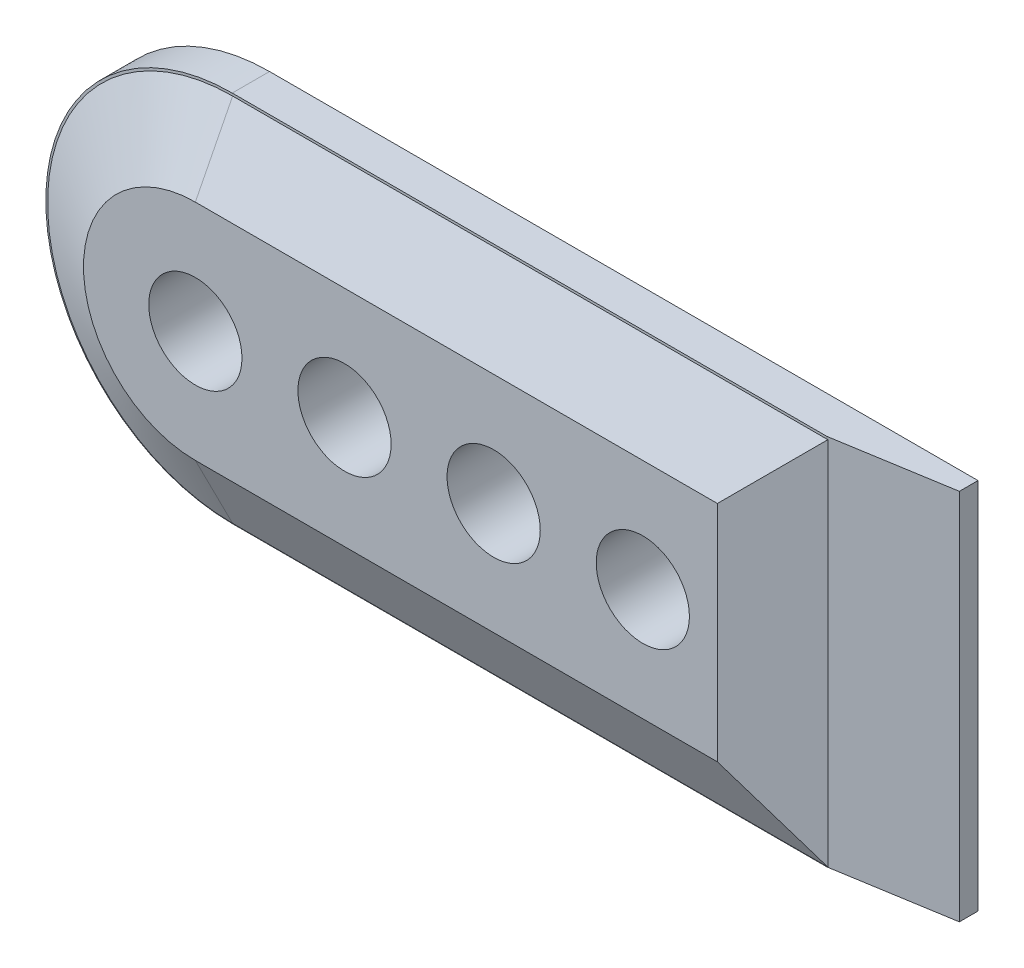
ISO-10303-21;
HEADER;
FILE_DESCRIPTION(('STEP AP214'),'2;1');
FILE_NAME('part.step','',(''),(''),'','','');
FILE_SCHEMA(('AUTOMOTIVE_DESIGN { 1 0 10303 214 1 1 1 1 }'));
ENDSEC;
DATA;
#1=APPLICATION_CONTEXT('core data for automotive mechanical design processes');
#2=APPLICATION_PROTOCOL_DEFINITION('international standard','automotive_design',2000,#1);
#3=PRODUCT_CONTEXT('',#1,'mechanical');
#4=PRODUCT('Part','Part','',(#3));
#5=PRODUCT_RELATED_PRODUCT_CATEGORY('part','',(#4));
#6=PRODUCT_DEFINITION_FORMATION('','',#4);
#7=PRODUCT_DEFINITION_CONTEXT('part definition',#1,'design');
#8=PRODUCT_DEFINITION('design','',#6,#7);
#9=PRODUCT_DEFINITION_SHAPE('','',#8);
#10=(LENGTH_UNIT() NAMED_UNIT(*) SI_UNIT(.MILLI.,.METRE.));
#11=(NAMED_UNIT(*) PLANE_ANGLE_UNIT() SI_UNIT($,.RADIAN.));
#12=(NAMED_UNIT(*) SI_UNIT($,.STERADIAN.) SOLID_ANGLE_UNIT());
#13=UNCERTAINTY_MEASURE_WITH_UNIT(LENGTH_MEASURE(1.E-05),#10,'distance_accuracy_value','');
#14=(GEOMETRIC_REPRESENTATION_CONTEXT(3) GLOBAL_UNCERTAINTY_ASSIGNED_CONTEXT((#13)) GLOBAL_UNIT_ASSIGNED_CONTEXT((#10,
#11,#12)) REPRESENTATION_CONTEXT('',''));
#15=CARTESIAN_POINT('',(0.,0.,0.));
#16=DIRECTION('',(0.,0.,1.));
#17=DIRECTION('',(1.,0.,0.));
#18=AXIS2_PLACEMENT_3D('',#15,#16,#17);
#19=CARTESIAN_POINT('',(-68.6937313432836,19.0594776119403,6.35));
#20=DIRECTION('',(0.,1.,0.));
#21=DIRECTION('',(-1.,0.,0.));
#22=AXIS2_PLACEMENT_3D('',#19,#20,#21);
#23=PLANE('',#22);
#24=DIRECTION('',(1.,0.,0.));
#25=VECTOR('',#24,1.);
#26=CARTESIAN_POINT('',(-68.6937313432836,19.0594776119403,6.35));
#27=LINE('',#26,#25);
#28=CARTESIAN_POINT('',(-68.6937313432836,19.0594776119403,6.35));
#29=VERTEX_POINT('',#28);
#30=CARTESIAN_POINT('',(32.5984115046971,19.0594776119403,6.35));
#31=VERTEX_POINT('',#30);
#32=EDGE_CURVE('E139',#29,#31,#27,.T.);
#33=ORIENTED_EDGE('',*,*,#32,.T.);
#34=DIRECTION('',(-0.986814797078086,0.,0.161853502488321));
#35=VECTOR('',#34,1.);
#36=CARTESIAN_POINT('',(1.86818450943302,19.0594776119403,11.3902516117227));
#37=LINE('',#36,#35);
#38=CARTESIAN_POINT('',(51.9562686567164,19.0594776119403,3.175));
#39=VERTEX_POINT('',#38);
#40=EDGE_CURVE('E124',#39,#31,#37,.T.);
#41=ORIENTED_EDGE('',*,*,#40,.F.);
#42=DIRECTION('',(0.,0.,-1.));
#43=VECTOR('',#42,1.);
#44=CARTESIAN_POINT('',(51.9562686567164,19.0594776119403,6.35));
#45=LINE('',#44,#43);
#46=CARTESIAN_POINT('',(51.9562686567164,19.0594776119403,0.));
#47=VERTEX_POINT('',#46);
#48=EDGE_CURVE('E43',#39,#47,#45,.T.);
#49=ORIENTED_EDGE('',*,*,#48,.T.);
#50=DIRECTION('',(1.,0.,0.));
#51=VECTOR('',#50,1.);
#52=CARTESIAN_POINT('',(-68.6937313432836,19.0594776119403,0.));
#53=LINE('',#52,#51);
#54=CARTESIAN_POINT('',(-68.6937313432836,19.0594776119403,0.));
#55=VERTEX_POINT('',#54);
#56=EDGE_CURVE('E160',#55,#47,#53,.T.);
#57=ORIENTED_EDGE('',*,*,#56,.F.);
#58=DIRECTION('',(0.,0.,-1.));
#59=VECTOR('',#58,1.);
#60=CARTESIAN_POINT('',(-68.6937313432836,19.0594776119403,6.35));
#61=LINE('',#60,#59);
#62=EDGE_CURVE('E12',#29,#55,#61,.T.);
#63=ORIENTED_EDGE('',*,*,#62,.F.);
#64=EDGE_LOOP('',(#33,#41,#49,#57,#63));
#65=FACE_BOUND('',#64,.T.);
#66=ADVANCED_FACE('F40',(#65),#23,.T.);
#67=CARTESIAN_POINT('',(-68.6937313432836,-44.4405223880597,6.35));
#68=DIRECTION('',(0.,1.,0.));
#69=DIRECTION('',(-1.,0.,0.));
#70=AXIS2_PLACEMENT_3D('',#67,#68,#69);
#71=PLANE('',#70);
#72=DIRECTION('',(-0.986814797078086,0.,0.161853502488321));
#73=VECTOR('',#72,1.);
#74=CARTESIAN_POINT('',(1.86818450943303,-44.4405223880597,11.3902516117227));
#75=LINE('',#74,#73);
#76=CARTESIAN_POINT('',(51.9562686567164,-44.4405223880597,3.175));
#77=VERTEX_POINT('',#76);
#78=CARTESIAN_POINT('',(32.5984115046971,-44.4405223880597,6.35));
#79=VERTEX_POINT('',#78);
#80=EDGE_CURVE('E127',#77,#79,#75,.T.);
#81=ORIENTED_EDGE('',*,*,#80,.T.);
#82=DIRECTION('',(1.,0.,0.));
#83=VECTOR('',#82,1.);
#84=CARTESIAN_POINT('',(-68.6937313432836,-44.4405223880597,6.35));
#85=LINE('',#84,#83);
#86=CARTESIAN_POINT('',(-68.6937313432836,-44.4405223880597,6.35));
#87=VERTEX_POINT('',#86);
#88=EDGE_CURVE('E151',#87,#79,#85,.T.);
#89=ORIENTED_EDGE('',*,*,#88,.F.);
#90=DIRECTION('',(0.,0.,-1.));
#91=VECTOR('',#90,1.);
#92=CARTESIAN_POINT('',(-68.6937313432836,-44.4405223880597,6.35));
#93=LINE('',#92,#91);
#94=CARTESIAN_POINT('',(-68.6937313432836,-44.4405223880597,0.));
#95=VERTEX_POINT('',#94);
#96=EDGE_CURVE('E49',#87,#95,#93,.T.);
#97=ORIENTED_EDGE('',*,*,#96,.T.);
#98=DIRECTION('',(1.,0.,0.));
#99=VECTOR('',#98,1.);
#100=CARTESIAN_POINT('',(-68.6937313432836,-44.4405223880597,0.));
#101=LINE('',#100,#99);
#102=CARTESIAN_POINT('',(51.9562686567164,-44.4405223880597,0.));
#103=VERTEX_POINT('',#102);
#104=EDGE_CURVE('E165',#95,#103,#101,.T.);
#105=ORIENTED_EDGE('',*,*,#104,.T.);
#106=DIRECTION('',(0.,0.,-1.));
#107=VECTOR('',#106,1.);
#108=CARTESIAN_POINT('',(51.9562686567164,-44.4405223880597,6.35));
#109=LINE('',#108,#107);
#110=EDGE_CURVE('E147',#77,#103,#109,.T.);
#111=ORIENTED_EDGE('',*,*,#110,.F.);
#112=EDGE_LOOP('',(#81,#89,#97,#105,#111));
#113=FACE_BOUND('',#112,.T.);
#114=ADVANCED_FACE('F177',(#113),#71,.F.);
#115=CARTESIAN_POINT('',(51.9562686567164,19.0594776119403,6.35));
#116=DIRECTION('',(1.,0.,0.));
#117=DIRECTION('',(0.,1.,0.));
#118=AXIS2_PLACEMENT_3D('',#115,#116,#117);
#119=PLANE('',#118);
#120=ORIENTED_EDGE('',*,*,#48,.F.);
#121=DIRECTION('',(0.,-1.,0.));
#122=VECTOR('',#121,1.);
#123=CARTESIAN_POINT('',(51.9562686567164,19.0594776119403,3.175));
#124=LINE('',#123,#122);
#125=EDGE_CURVE('E120',#39,#77,#124,.T.);
#126=ORIENTED_EDGE('',*,*,#125,.T.);
#127=ORIENTED_EDGE('',*,*,#110,.T.);
#128=DIRECTION('',(0.,-1.,0.));
#129=VECTOR('',#128,1.);
#130=CARTESIAN_POINT('',(51.9562686567164,19.0594776119403,0.));
#131=LINE('',#130,#129);
#132=EDGE_CURVE('E144',#47,#103,#131,.T.);
#133=ORIENTED_EDGE('',*,*,#132,.F.);
#134=EDGE_LOOP('',(#120,#126,#127,#133));
#135=FACE_BOUND('',#134,.T.);
#136=ADVANCED_FACE('F142',(#135),#119,.T.);
#137=CARTESIAN_POINT('',(-68.6937313432836,-12.6905223880597,6.35));
#138=DIRECTION('',(0.,0.,1.));
#139=DIRECTION('',(1.,0.,0.));
#140=AXIS2_PLACEMENT_3D('',#137,#138,#139);
#141=PLANE('',#140);
#142=ORIENTED_EDGE('',*,*,#88,.T.);
#143=DIRECTION('',(0.,-1.,0.));
#144=VECTOR('',#143,1.);
#145=CARTESIAN_POINT('',(32.5984115046971,19.0594776119403,6.35));
#146=LINE('',#145,#144);
#147=CARTESIAN_POINT('',(32.5984115046971,-44.3764724139776,6.35));
#148=VERTEX_POINT('',#147);
#149=EDGE_CURVE('E132',#148,#79,#146,.T.);
#150=ORIENTED_EDGE('',*,*,#149,.F.);
#151=DIRECTION('',(-1.,0.,0.));
#152=VECTOR('',#151,1.);
#153=CARTESIAN_POINT('',(-68.6273002290876,-44.3764724139776,6.35));
#154=LINE('',#153,#152);
#155=CARTESIAN_POINT('',(-68.6273002290876,-44.3764724139776,6.35));
#156=VERTEX_POINT('',#155);
#157=EDGE_CURVE('E64',#156,#148,#154,.F.);
#158=ORIENTED_EDGE('',*,*,#157,.F.);
#159=CARTESIAN_POINT('',(-68.6273002290876,-12.8638957040198,6.35));
#160=DIRECTION('',(0.,0.,1.));
#161=DIRECTION('',(1.,0.,0.));
#162=AXIS2_PLACEMENT_3D('',#159,#160,#161);
#163=CIRCLE('',#162,31.5125767099578);
#164=CARTESIAN_POINT('',(-68.6273002290876,18.648681005938,6.35));
#165=VERTEX_POINT('',#164);
#166=EDGE_CURVE('E225',#165,#156,#163,.T.);
#167=ORIENTED_EDGE('',*,*,#166,.F.);
#168=DIRECTION('',(1.,0.,0.));
#169=VECTOR('',#168,1.);
#170=CARTESIAN_POINT('',(-68.6273002290876,18.648681005938,6.35));
#171=LINE('',#170,#169);
#172=CARTESIAN_POINT('',(32.5984115046971,18.648681005938,6.35));
#173=VERTEX_POINT('',#172);
#174=EDGE_CURVE('E57',#173,#165,#171,.F.);
#175=ORIENTED_EDGE('',*,*,#174,.F.);
#176=EDGE_CURVE('E184',#31,#173,#146,.T.);
#177=ORIENTED_EDGE('',*,*,#176,.F.);
#178=ORIENTED_EDGE('',*,*,#32,.F.);
#179=CARTESIAN_POINT('',(-68.6937313432836,-12.6905223880597,6.35));
#180=DIRECTION('',(0.,0.,1.));
#181=DIRECTION('',(1.,0.,0.));
#182=AXIS2_PLACEMENT_3D('',#179,#180,#181);
#183=CIRCLE('',#182,31.75);
#184=EDGE_CURVE('E148',#29,#87,#183,.T.);
#185=ORIENTED_EDGE('',*,*,#184,.T.);
#186=EDGE_LOOP('',(#142,#150,#158,#167,#175,#177,#178,#185));
#187=FACE_BOUND('',#186,.T.);
#188=ADVANCED_FACE('F183',(#187),#141,.T.);
#189=CARTESIAN_POINT('',(-68.6937313432836,-12.6905223880597,6.35));
#190=DIRECTION('',(0.,0.,-1.));
#191=DIRECTION('',(-1.,0.,0.));
#192=AXIS2_PLACEMENT_3D('',#189,#190,#191);
#193=CYLINDRICAL_SURFACE('',#192,31.75);
#194=CARTESIAN_POINT('',(-68.6937313432836,-12.6905223880597,0.));
#195=DIRECTION('',(0.,0.,1.));
#196=DIRECTION('',(1.,0.,0.));
#197=AXIS2_PLACEMENT_3D('',#194,#195,#196);
#198=CIRCLE('',#197,31.75);
#199=EDGE_CURVE('E169',#55,#95,#198,.T.);
#200=ORIENTED_EDGE('',*,*,#199,.T.);
#201=ORIENTED_EDGE('',*,*,#96,.F.);
#202=ORIENTED_EDGE('',*,*,#184,.F.);
#203=ORIENTED_EDGE('',*,*,#62,.T.);
#204=EDGE_LOOP('',(#200,#201,#202,#203));
#205=FACE_BOUND('',#204,.T.);
#206=ADVANCED_FACE('F182',(#205),#193,.T.);
#207=CARTESIAN_POINT('',(-68.6937313432836,-12.6905223880597,0.));
#208=DIRECTION('',(0.,0.,1.));
#209=DIRECTION('',(1.,0.,0.));
#210=AXIS2_PLACEMENT_3D('',#207,#208,#209);
#211=PLANE('',#210);
#212=CARTESIAN_POINT('',(-68.6273002290876,-12.8638957040198,0.));
#213=DIRECTION('',(0.,0.,1.));
#214=DIRECTION('',(1.,0.,0.));
#215=AXIS2_PLACEMENT_3D('',#212,#213,#214);
#216=CIRCLE('',#215,7.9375);
#217=CARTESIAN_POINT('',(-60.6898002290876,-12.8638957040198,0.));
#218=VERTEX_POINT('',#217);
#219=EDGE_CURVE('E236',#218,#218,#216,.T.);
#220=ORIENTED_EDGE('',*,*,#219,.T.);
#221=EDGE_LOOP('',(#220));
#222=FACE_BOUND('',#221,.T.);
#223=CARTESIAN_POINT('',(-43.2273002290876,-12.8638957040198,0.));
#224=DIRECTION('',(0.,0.,1.));
#225=DIRECTION('',(1.,0.,0.));
#226=AXIS2_PLACEMENT_3D('',#223,#224,#225);
#227=CIRCLE('',#226,7.9375);
#228=CARTESIAN_POINT('',(-35.2898002290876,-12.8638957040198,0.));
#229=VERTEX_POINT('',#228);
#230=EDGE_CURVE('E241',#229,#229,#227,.T.);
#231=ORIENTED_EDGE('',*,*,#230,.T.);
#232=EDGE_LOOP('',(#231));
#233=FACE_BOUND('',#232,.T.);
#234=CARTESIAN_POINT('',(-17.8273002290876,-12.8638957040198,0.));
#235=DIRECTION('',(0.,0.,1.));
#236=DIRECTION('',(1.,0.,0.));
#237=AXIS2_PLACEMENT_3D('',#234,#235,#236);
#238=CIRCLE('',#237,7.9375);
#239=CARTESIAN_POINT('',(-9.88980022908756,-12.8638957040198,0.));
#240=VERTEX_POINT('',#239);
#241=EDGE_CURVE('E245',#240,#240,#238,.T.);
#242=ORIENTED_EDGE('',*,*,#241,.T.);
#243=EDGE_LOOP('',(#242));
#244=FACE_BOUND('',#243,.T.);
#245=CARTESIAN_POINT('',(7.57269977091243,-12.8638957040198,0.));
#246=DIRECTION('',(0.,0.,1.));
#247=DIRECTION('',(1.,0.,0.));
#248=AXIS2_PLACEMENT_3D('',#245,#246,#247);
#249=CIRCLE('',#248,7.9375);
#250=CARTESIAN_POINT('',(15.5101997709124,-12.8638957040198,0.));
#251=VERTEX_POINT('',#250);
#252=EDGE_CURVE('E249',#251,#251,#249,.T.);
#253=ORIENTED_EDGE('',*,*,#252,.T.);
#254=EDGE_LOOP('',(#253));
#255=FACE_BOUND('',#254,.T.);
#256=ORIENTED_EDGE('',*,*,#56,.T.);
#257=ORIENTED_EDGE('',*,*,#132,.T.);
#258=ORIENTED_EDGE('',*,*,#104,.F.);
#259=ORIENTED_EDGE('',*,*,#199,.F.);
#260=EDGE_LOOP('',(#256,#257,#258,#259));
#261=FACE_BOUND('',#260,.T.);
#262=ADVANCED_FACE('F181',(#222,#233,#244,#255,#261),#211,.F.);
#263=CARTESIAN_POINT('',(0.,0.,12.7));
#264=DIRECTION('',(0.,0.,1.));
#265=DIRECTION('',(1.,0.,0.));
#266=AXIS2_PLACEMENT_3D('',#263,#264,#265);
#267=PLANE('',#266);
#268=CARTESIAN_POINT('',(-68.6273002290876,-12.8638957040198,12.7));
#269=DIRECTION('',(0.,0.,1.));
#270=DIRECTION('',(1.,0.,0.));
#271=AXIS2_PLACEMENT_3D('',#268,#269,#270);
#272=CIRCLE('',#271,7.9375);
#273=CARTESIAN_POINT('',(-60.6898002290876,-12.8638957040198,12.7));
#274=VERTEX_POINT('',#273);
#275=EDGE_CURVE('E253',#274,#274,#272,.T.);
#276=ORIENTED_EDGE('',*,*,#275,.F.);
#277=EDGE_LOOP('',(#276));
#278=FACE_BOUND('',#277,.T.);
#279=CARTESIAN_POINT('',(-43.2273002290876,-12.8638957040198,12.7));
#280=DIRECTION('',(0.,0.,1.));
#281=DIRECTION('',(1.,0.,0.));
#282=AXIS2_PLACEMENT_3D('',#279,#280,#281);
#283=CIRCLE('',#282,7.9375);
#284=CARTESIAN_POINT('',(-35.2898002290876,-12.8638957040198,12.7));
#285=VERTEX_POINT('',#284);
#286=EDGE_CURVE('E262',#285,#285,#283,.T.);
#287=ORIENTED_EDGE('',*,*,#286,.F.);
#288=EDGE_LOOP('',(#287));
#289=FACE_BOUND('',#288,.T.);
#290=CARTESIAN_POINT('',(-17.8273002290876,-12.8638957040198,12.7));
#291=DIRECTION('',(0.,0.,1.));
#292=DIRECTION('',(1.,0.,0.));
#293=AXIS2_PLACEMENT_3D('',#290,#291,#292);
#294=CIRCLE('',#293,7.9375);
#295=CARTESIAN_POINT('',(-9.88980022908756,-12.8638957040198,12.7));
#296=VERTEX_POINT('',#295);
#297=EDGE_CURVE('E258',#296,#296,#294,.T.);
#298=ORIENTED_EDGE('',*,*,#297,.F.);
#299=EDGE_LOOP('',(#298));
#300=FACE_BOUND('',#299,.T.);
#301=CARTESIAN_POINT('',(7.57269977091243,-12.8638957040198,12.7));
#302=DIRECTION('',(0.,0.,1.));
#303=DIRECTION('',(1.,0.,0.));
#304=AXIS2_PLACEMENT_3D('',#301,#302,#303);
#305=CIRCLE('',#304,7.9375);
#306=CARTESIAN_POINT('',(15.5101997709124,-12.8638957040198,12.7));
#307=VERTEX_POINT('',#306);
#308=EDGE_CURVE('E254',#307,#307,#305,.T.);
#309=ORIENTED_EDGE('',*,*,#308,.F.);
#310=EDGE_LOOP('',(#309));
#311=FACE_BOUND('',#310,.T.);
#312=DIRECTION('',(1.,0.,0.));
#313=VECTOR('',#312,1.);
#314=CARTESIAN_POINT('',(-68.6273002290876,-31.9138957040198,12.7));
#315=LINE('',#314,#313);
#316=CARTESIAN_POINT('',(-68.6273002290876,-31.9138957040198,12.7));
#317=VERTEX_POINT('',#316);
#318=CARTESIAN_POINT('',(20.2726997709124,-31.9138957040198,12.7));
#319=VERTEX_POINT('',#318);
#320=EDGE_CURVE('E206',#317,#319,#315,.T.);
#321=ORIENTED_EDGE('',*,*,#320,.T.);
#322=DIRECTION('',(0.,1.,0.));
#323=VECTOR('',#322,1.);
#324=CARTESIAN_POINT('',(20.2726997709124,-31.9138957040198,12.7));
#325=LINE('',#324,#323);
#326=CARTESIAN_POINT('',(20.2726997709124,6.18610429598019,12.7));
#327=VERTEX_POINT('',#326);
#328=EDGE_CURVE('E191',#319,#327,#325,.T.);
#329=ORIENTED_EDGE('',*,*,#328,.T.);
#330=DIRECTION('',(-1.,0.,0.));
#331=VECTOR('',#330,1.);
#332=CARTESIAN_POINT('',(-68.6273002290876,6.18610429598019,12.7));
#333=LINE('',#332,#331);
#334=CARTESIAN_POINT('',(-68.6273002290876,6.18610429598019,12.7));
#335=VERTEX_POINT('',#334);
#336=EDGE_CURVE('E202',#327,#335,#333,.T.);
#337=ORIENTED_EDGE('',*,*,#336,.T.);
#338=CARTESIAN_POINT('',(-68.6273002290876,-12.8638957040198,12.7));
#339=DIRECTION('',(0.,0.,1.));
#340=DIRECTION('',(1.,0.,0.));
#341=AXIS2_PLACEMENT_3D('',#338,#339,#340);
#342=CIRCLE('',#341,19.05);
#343=EDGE_CURVE('E196',#335,#317,#342,.T.);
#344=ORIENTED_EDGE('',*,*,#343,.T.);
#345=EDGE_LOOP('',(#321,#329,#337,#344));
#346=FACE_BOUND('',#345,.T.);
#347=ADVANCED_FACE('F273',(#278,#289,#300,#311,#346),#267,.T.);
#348=CARTESIAN_POINT('',(20.2726997709124,-31.9138957040198,12.7));
#349=DIRECTION('',(0.453990499739545,0.,0.891006524188369));
#350=DIRECTION('',(0.891006524188369,0.,-0.453990499739545));
#351=AXIS2_PLACEMENT_3D('',#348,#349,#350);
#352=PLANE('',#351);
#353=DIRECTION('',(0.665246597127309,-0.665246597127309,-0.338960071425929));
#354=VECTOR('',#353,1.);
#355=CARTESIAN_POINT('',(20.2726997709124,-31.9138957040198,12.7));
#356=LINE('',#355,#354);
#357=CARTESIAN_POINT('',(32.7352764808702,-44.3764724139776,6.35));
#358=VERTEX_POINT('',#357);
#359=EDGE_CURVE('E197',#319,#358,#356,.T.);
#360=ORIENTED_EDGE('',*,*,#359,.T.);
#361=DIRECTION('',(0.,-1.,0.));
#362=VECTOR('',#361,1.);
#363=CARTESIAN_POINT('',(32.7352764808702,-31.9138957040198,6.35));
#364=LINE('',#363,#362);
#365=CARTESIAN_POINT('',(32.7352764808702,18.648681005938,6.35));
#366=VERTEX_POINT('',#365);
#367=EDGE_CURVE('E187',#358,#366,#364,.F.);
#368=ORIENTED_EDGE('',*,*,#367,.T.);
#369=DIRECTION('',(0.665246597127309,0.665246597127309,-0.338960071425929));
#370=VECTOR('',#369,1.);
#371=CARTESIAN_POINT('',(-19.070265039651,-33.1568605145832,32.7462418295457));
#372=LINE('',#371,#370);
#373=EDGE_CURVE('E198',#327,#366,#372,.T.);
#374=ORIENTED_EDGE('',*,*,#373,.F.);
#375=ORIENTED_EDGE('',*,*,#328,.F.);
#376=EDGE_LOOP('',(#360,#368,#374,#375));
#377=FACE_BOUND('',#376,.T.);
#378=ADVANCED_FACE('F276',(#377),#352,.T.);
#379=CARTESIAN_POINT('',(-68.6273002290876,6.18610429598019,12.7));
#380=DIRECTION('',(0.,0.453990499739545,0.891006524188369));
#381=DIRECTION('',(0.,-0.891006524188369,0.453990499739545));
#382=AXIS2_PLACEMENT_3D('',#379,#380,#381);
#383=PLANE('',#382);
#384=ORIENTED_EDGE('',*,*,#373,.T.);
#385=EDGE_CURVE('E229',#366,#173,#171,.F.);
#386=ORIENTED_EDGE('',*,*,#385,.T.);
#387=ORIENTED_EDGE('',*,*,#174,.T.);
#388=DIRECTION('',(0.,0.891006524188369,-0.453990499739545));
#389=VECTOR('',#388,1.);
#390=CARTESIAN_POINT('',(-68.6273002290876,6.18610429598019,12.7));
#391=LINE('',#390,#389);
#392=EDGE_CURVE('E192',#335,#165,#391,.T.);
#393=ORIENTED_EDGE('',*,*,#392,.F.);
#394=ORIENTED_EDGE('',*,*,#336,.F.);
#395=EDGE_LOOP('',(#384,#386,#387,#393,#394));
#396=FACE_BOUND('',#395,.T.);
#397=ADVANCED_FACE('F292',(#396),#383,.T.);
#398=CARTESIAN_POINT('',(-68.6273002290876,-12.8638957040198,12.7));
#399=DIRECTION('',(0.,0.,-1.));
#400=DIRECTION('',(1.,0.,0.));
#401=AXIS2_PLACEMENT_3D('',#398,#399,#400);
#402=CONICAL_SURFACE('',#401,19.05,1.09955742875643);
#403=ORIENTED_EDGE('',*,*,#392,.T.);
#404=ORIENTED_EDGE('',*,*,#166,.T.);
#405=DIRECTION('',(0.,-0.891006524188369,-0.453990499739545));
#406=VECTOR('',#405,1.);
#407=CARTESIAN_POINT('',(-68.6273002290876,-31.9138957040198,12.7));
#408=LINE('',#407,#406);
#409=EDGE_CURVE('E203',#317,#156,#408,.T.);
#410=ORIENTED_EDGE('',*,*,#409,.F.);
#411=ORIENTED_EDGE('',*,*,#343,.F.);
#412=EDGE_LOOP('',(#403,#404,#410,#411));
#413=FACE_BOUND('',#412,.T.);
#414=ADVANCED_FACE('F290',(#413),#402,.T.);
#415=CARTESIAN_POINT('',(-68.6273002290876,-31.9138957040198,12.7));
#416=DIRECTION('',(0.,-0.453990499739545,0.891006524188369));
#417=DIRECTION('',(0.,-0.891006524188369,-0.453990499739545));
#418=AXIS2_PLACEMENT_3D('',#415,#416,#417);
#419=PLANE('',#418);
#420=ORIENTED_EDGE('',*,*,#409,.T.);
#421=ORIENTED_EDGE('',*,*,#157,.T.);
#422=EDGE_CURVE('E224',#148,#358,#154,.F.);
#423=ORIENTED_EDGE('',*,*,#422,.T.);
#424=ORIENTED_EDGE('',*,*,#359,.F.);
#425=ORIENTED_EDGE('',*,*,#320,.F.);
#426=EDGE_LOOP('',(#420,#421,#423,#424,#425));
#427=FACE_BOUND('',#426,.T.);
#428=ADVANCED_FACE('F287',(#427),#419,.T.);
#429=CARTESIAN_POINT('',(0.,19.0594776119403,6.35));
#430=DIRECTION('',(0.,0.,1.));
#431=DIRECTION('',(1.,0.,0.));
#432=AXIS2_PLACEMENT_3D('',#429,#430,#431);
#433=PLANE('',#432);
#434=ORIENTED_EDGE('',*,*,#367,.F.);
#435=ORIENTED_EDGE('',*,*,#422,.F.);
#436=EDGE_CURVE('E234',#173,#148,#146,.T.);
#437=ORIENTED_EDGE('',*,*,#436,.F.);
#438=ORIENTED_EDGE('',*,*,#385,.F.);
#439=EDGE_LOOP('',(#434,#435,#437,#438));
#440=FACE_BOUND('',#439,.T.);
#441=ADVANCED_FACE('F295',(#440),#433,.F.);
#442=CARTESIAN_POINT('',(1.86818450943302,19.0594776119403,11.3902516117227));
#443=DIRECTION('',(0.161853502488321,0.,0.986814797078085));
#444=DIRECTION('',(0.986814797078086,0.,-0.161853502488321));
#445=AXIS2_PLACEMENT_3D('',#442,#443,#444);
#446=PLANE('',#445);
#447=ORIENTED_EDGE('',*,*,#80,.F.);
#448=ORIENTED_EDGE('',*,*,#125,.F.);
#449=ORIENTED_EDGE('',*,*,#40,.T.);
#450=ORIENTED_EDGE('',*,*,#176,.T.);
#451=ORIENTED_EDGE('',*,*,#436,.T.);
#452=ORIENTED_EDGE('',*,*,#149,.T.);
#453=EDGE_LOOP('',(#447,#448,#449,#450,#451,#452));
#454=FACE_BOUND('',#453,.T.);
#455=ADVANCED_FACE('F122',(#454),#446,.T.);
#456=CARTESIAN_POINT('',(7.57269977091243,-12.8638957040198,-241.3));
#457=DIRECTION('',(0.,0.,1.));
#458=DIRECTION('',(1.,0.,0.));
#459=AXIS2_PLACEMENT_3D('',#456,#457,#458);
#460=CYLINDRICAL_SURFACE('',#459,7.9375);
#461=ORIENTED_EDGE('',*,*,#308,.T.);
#462=EDGE_LOOP('',(#461));
#463=FACE_BOUND('',#462,.T.);
#464=ORIENTED_EDGE('',*,*,#252,.F.);
#465=EDGE_LOOP('',(#464));
#466=FACE_BOUND('',#465,.T.);
#467=ADVANCED_FACE('F334',(#463,#466),#460,.F.);
#468=CARTESIAN_POINT('',(-17.8273002290876,-12.8638957040198,-241.3));
#469=DIRECTION('',(0.,0.,1.));
#470=DIRECTION('',(1.,0.,0.));
#471=AXIS2_PLACEMENT_3D('',#468,#469,#470);
#472=CYLINDRICAL_SURFACE('',#471,7.9375);
#473=ORIENTED_EDGE('',*,*,#297,.T.);
#474=EDGE_LOOP('',(#473));
#475=FACE_BOUND('',#474,.T.);
#476=ORIENTED_EDGE('',*,*,#241,.F.);
#477=EDGE_LOOP('',(#476));
#478=FACE_BOUND('',#477,.T.);
#479=ADVANCED_FACE('F338',(#475,#478),#472,.F.);
#480=CARTESIAN_POINT('',(-43.2273002290876,-12.8638957040198,-241.3));
#481=DIRECTION('',(0.,0.,1.));
#482=DIRECTION('',(1.,0.,0.));
#483=AXIS2_PLACEMENT_3D('',#480,#481,#482);
#484=CYLINDRICAL_SURFACE('',#483,7.9375);
#485=ORIENTED_EDGE('',*,*,#286,.T.);
#486=EDGE_LOOP('',(#485));
#487=FACE_BOUND('',#486,.T.);
#488=ORIENTED_EDGE('',*,*,#230,.F.);
#489=EDGE_LOOP('',(#488));
#490=FACE_BOUND('',#489,.T.);
#491=ADVANCED_FACE('F342',(#487,#490),#484,.F.);
#492=CARTESIAN_POINT('',(-68.6273002290876,-12.8638957040198,-241.3));
#493=DIRECTION('',(0.,0.,1.));
#494=DIRECTION('',(1.,0.,0.));
#495=AXIS2_PLACEMENT_3D('',#492,#493,#494);
#496=CYLINDRICAL_SURFACE('',#495,7.9375);
#497=ORIENTED_EDGE('',*,*,#275,.T.);
#498=EDGE_LOOP('',(#497));
#499=FACE_BOUND('',#498,.T.);
#500=ORIENTED_EDGE('',*,*,#219,.F.);
#501=EDGE_LOOP('',(#500));
#502=FACE_BOUND('',#501,.T.);
#503=ADVANCED_FACE('F270',(#499,#502),#496,.F.);
#504=CLOSED_SHELL('',(#66,#114,#136,#188,#206,#262,#347,#378,#397,#414,#428,#441,#455,#467,#479,
#491,#503));
#505=MANIFOLD_SOLID_BREP('B2',#504);
#506=ADVANCED_BREP_SHAPE_REPRESENTATION('',(#18,#505),#14);
#507=SHAPE_DEFINITION_REPRESENTATION(#9,#506);
ENDSEC;
END-ISO-10303-21;
